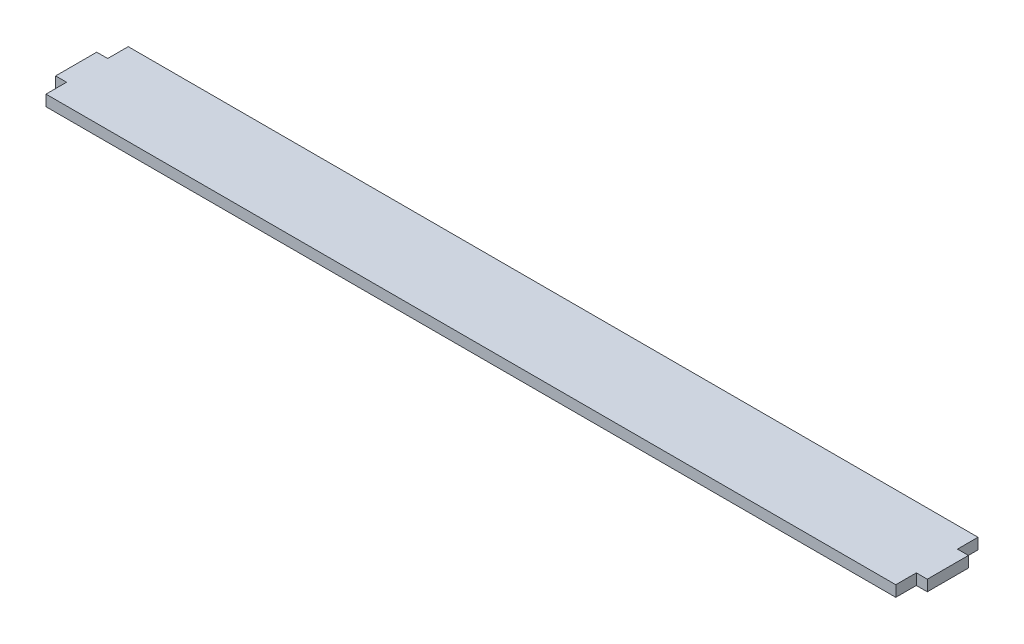
ISO-10303-21;
HEADER;
FILE_DESCRIPTION(('STEP AP214'),'2;1');
FILE_NAME('part.step','',(''),(''),'','','');
FILE_SCHEMA(('AUTOMOTIVE_DESIGN { 1 0 10303 214 1 1 1 1 }'));
ENDSEC;
DATA;
#1=APPLICATION_CONTEXT('core data for automotive mechanical design processes');
#2=APPLICATION_PROTOCOL_DEFINITION('international standard','automotive_design',2000,#1);
#3=PRODUCT_CONTEXT('',#1,'mechanical');
#4=PRODUCT('Part','Part','',(#3));
#5=PRODUCT_RELATED_PRODUCT_CATEGORY('part','',(#4));
#6=PRODUCT_DEFINITION_FORMATION('','',#4);
#7=PRODUCT_DEFINITION_CONTEXT('part definition',#1,'design');
#8=PRODUCT_DEFINITION('design','',#6,#7);
#9=PRODUCT_DEFINITION_SHAPE('','',#8);
#10=(LENGTH_UNIT() NAMED_UNIT(*) SI_UNIT(.MILLI.,.METRE.));
#11=(NAMED_UNIT(*) PLANE_ANGLE_UNIT() SI_UNIT($,.RADIAN.));
#12=(NAMED_UNIT(*) SI_UNIT($,.STERADIAN.) SOLID_ANGLE_UNIT());
#13=UNCERTAINTY_MEASURE_WITH_UNIT(LENGTH_MEASURE(1.E-05),#10,'distance_accuracy_value','');
#14=(GEOMETRIC_REPRESENTATION_CONTEXT(3) GLOBAL_UNCERTAINTY_ASSIGNED_CONTEXT((#13)) GLOBAL_UNIT_ASSIGNED_CONTEXT((#10,
#11,#12)) REPRESENTATION_CONTEXT('',''));
#15=CARTESIAN_POINT('',(0.,0.,0.));
#16=DIRECTION('',(0.,0.,1.));
#17=DIRECTION('',(1.,0.,0.));
#18=AXIS2_PLACEMENT_3D('',#15,#16,#17);
#19=CARTESIAN_POINT('',(159.,4.,0.));
#20=DIRECTION('',(1.,0.,0.));
#21=DIRECTION('',(0.,0.,-1.));
#22=AXIS2_PLACEMENT_3D('',#19,#20,#21);
#23=PLANE('',#22);
#24=DIRECTION('',(0.,0.,1.));
#25=VECTOR('',#24,1.);
#26=CARTESIAN_POINT('',(159.,0.,0.));
#27=LINE('',#26,#25);
#28=CARTESIAN_POINT('',(159.,0.,-7.5));
#29=VERTEX_POINT('',#28);
#30=CARTESIAN_POINT('',(159.,0.,7.5));
#31=VERTEX_POINT('',#30);
#32=EDGE_CURVE('E204',#29,#31,#27,.T.);
#33=ORIENTED_EDGE('',*,*,#32,.F.);
#34=DIRECTION('',(0.,-1.,0.));
#35=VECTOR('',#34,1.);
#36=CARTESIAN_POINT('',(159.,4.,-7.5));
#37=LINE('',#36,#35);
#38=CARTESIAN_POINT('',(159.,4.,-7.5));
#39=VERTEX_POINT('',#38);
#40=EDGE_CURVE('E12',#39,#29,#37,.T.);
#41=ORIENTED_EDGE('',*,*,#40,.F.);
#42=DIRECTION('',(0.,0.,1.));
#43=VECTOR('',#42,1.);
#44=CARTESIAN_POINT('',(159.,4.,0.));
#45=LINE('',#44,#43);
#46=CARTESIAN_POINT('',(159.,4.,7.5));
#47=VERTEX_POINT('',#46);
#48=EDGE_CURVE('E266',#39,#47,#45,.T.);
#49=ORIENTED_EDGE('',*,*,#48,.T.);
#50=DIRECTION('',(0.,-1.,0.));
#51=VECTOR('',#50,1.);
#52=CARTESIAN_POINT('',(159.,4.,7.5));
#53=LINE('',#52,#51);
#54=EDGE_CURVE('E261',#47,#31,#53,.T.);
#55=ORIENTED_EDGE('',*,*,#54,.T.);
#56=EDGE_LOOP('',(#33,#41,#49,#55));
#57=FACE_BOUND('',#56,.T.);
#58=ADVANCED_FACE('F87',(#57),#23,.T.);
#59=CARTESIAN_POINT('',(0.,4.,-7.5));
#60=DIRECTION('',(0.,0.,-1.));
#61=DIRECTION('',(-1.,0.,0.));
#62=AXIS2_PLACEMENT_3D('',#59,#60,#61);
#63=PLANE('',#62);
#64=DIRECTION('',(1.,0.,0.));
#65=VECTOR('',#64,1.);
#66=CARTESIAN_POINT('',(0.,0.,-7.5));
#67=LINE('',#66,#65);
#68=CARTESIAN_POINT('',(155.,0.,-7.5));
#69=VERTEX_POINT('',#68);
#70=EDGE_CURVE('E267',#69,#29,#67,.T.);
#71=ORIENTED_EDGE('',*,*,#70,.F.);
#72=DIRECTION('',(0.,-1.,0.));
#73=VECTOR('',#72,1.);
#74=CARTESIAN_POINT('',(155.,4.,-7.5));
#75=LINE('',#74,#73);
#76=CARTESIAN_POINT('',(155.,4.,-7.5));
#77=VERTEX_POINT('',#76);
#78=EDGE_CURVE('E97',#77,#69,#75,.T.);
#79=ORIENTED_EDGE('',*,*,#78,.F.);
#80=DIRECTION('',(1.,0.,0.));
#81=VECTOR('',#80,1.);
#82=CARTESIAN_POINT('',(0.,4.,-7.5));
#83=LINE('',#82,#81);
#84=EDGE_CURVE('E272',#77,#39,#83,.T.);
#85=ORIENTED_EDGE('',*,*,#84,.T.);
#86=ORIENTED_EDGE('',*,*,#40,.T.);
#87=EDGE_LOOP('',(#71,#79,#85,#86));
#88=FACE_BOUND('',#87,.T.);
#89=ADVANCED_FACE('F286',(#88),#63,.T.);
#90=CARTESIAN_POINT('',(0.,4.,7.5));
#91=DIRECTION('',(0.,0.,-1.));
#92=DIRECTION('',(-1.,0.,0.));
#93=AXIS2_PLACEMENT_3D('',#90,#91,#92);
#94=PLANE('',#93);
#95=DIRECTION('',(1.,0.,0.));
#96=VECTOR('',#95,1.);
#97=CARTESIAN_POINT('',(0.,0.,7.5));
#98=LINE('',#97,#96);
#99=CARTESIAN_POINT('',(155.,0.,7.5));
#100=VERTEX_POINT('',#99);
#101=EDGE_CURVE('E263',#100,#31,#98,.T.);
#102=ORIENTED_EDGE('',*,*,#101,.T.);
#103=ORIENTED_EDGE('',*,*,#54,.F.);
#104=DIRECTION('',(1.,0.,0.));
#105=VECTOR('',#104,1.);
#106=CARTESIAN_POINT('',(0.,4.,7.5));
#107=LINE('',#106,#105);
#108=CARTESIAN_POINT('',(155.,4.,7.5));
#109=VERTEX_POINT('',#108);
#110=EDGE_CURVE('E106',#109,#47,#107,.T.);
#111=ORIENTED_EDGE('',*,*,#110,.F.);
#112=DIRECTION('',(0.,-1.,0.));
#113=VECTOR('',#112,1.);
#114=CARTESIAN_POINT('',(155.,4.,7.5));
#115=LINE('',#114,#113);
#116=EDGE_CURVE('E259',#109,#100,#115,.T.);
#117=ORIENTED_EDGE('',*,*,#116,.T.);
#118=EDGE_LOOP('',(#102,#103,#111,#117));
#119=FACE_BOUND('',#118,.T.);
#120=ADVANCED_FACE('F298',(#119),#94,.F.);
#121=CARTESIAN_POINT('',(0.,4.,0.));
#122=DIRECTION('',(0.,1.,0.));
#123=DIRECTION('',(0.,0.,1.));
#124=AXIS2_PLACEMENT_3D('',#121,#122,#123);
#125=PLANE('',#124);
#126=ORIENTED_EDGE('',*,*,#48,.F.);
#127=ORIENTED_EDGE('',*,*,#84,.F.);
#128=DIRECTION('',(0.,0.,1.));
#129=VECTOR('',#128,1.);
#130=CARTESIAN_POINT('',(155.,4.,-15.));
#131=LINE('',#130,#129);
#132=CARTESIAN_POINT('',(155.,4.,-15.));
#133=VERTEX_POINT('',#132);
#134=EDGE_CURVE('E255',#133,#77,#131,.T.);
#135=ORIENTED_EDGE('',*,*,#134,.F.);
#136=DIRECTION('',(1.,0.,0.));
#137=VECTOR('',#136,1.);
#138=CARTESIAN_POINT('',(-155.,4.,-15.));
#139=LINE('',#138,#137);
#140=CARTESIAN_POINT('',(-155.,4.,-15.));
#141=VERTEX_POINT('',#140);
#142=EDGE_CURVE('E233',#141,#133,#139,.T.);
#143=ORIENTED_EDGE('',*,*,#142,.F.);
#144=DIRECTION('',(0.,0.,1.));
#145=VECTOR('',#144,1.);
#146=CARTESIAN_POINT('',(-155.,4.,-15.));
#147=LINE('',#146,#145);
#148=CARTESIAN_POINT('',(-155.,4.,-7.5));
#149=VERTEX_POINT('',#148);
#150=EDGE_CURVE('E225',#141,#149,#147,.T.);
#151=ORIENTED_EDGE('',*,*,#150,.T.);
#152=DIRECTION('',(-1.,0.,0.));
#153=VECTOR('',#152,1.);
#154=CARTESIAN_POINT('',(-155.,4.,-7.5));
#155=LINE('',#154,#153);
#156=CARTESIAN_POINT('',(-159.,4.,-7.5));
#157=VERTEX_POINT('',#156);
#158=EDGE_CURVE('E195',#149,#157,#155,.T.);
#159=ORIENTED_EDGE('',*,*,#158,.T.);
#160=DIRECTION('',(0.,0.,1.));
#161=VECTOR('',#160,1.);
#162=CARTESIAN_POINT('',(-159.,4.,-7.5));
#163=LINE('',#162,#161);
#164=CARTESIAN_POINT('',(-159.,4.,7.5));
#165=VERTEX_POINT('',#164);
#166=EDGE_CURVE('E198',#157,#165,#163,.T.);
#167=ORIENTED_EDGE('',*,*,#166,.T.);
#168=DIRECTION('',(-1.,0.,0.));
#169=VECTOR('',#168,1.);
#170=CARTESIAN_POINT('',(-155.,4.,7.5));
#171=LINE('',#170,#169);
#172=CARTESIAN_POINT('',(-155.,4.,7.5));
#173=VERTEX_POINT('',#172);
#174=EDGE_CURVE('E184',#173,#165,#171,.T.);
#175=ORIENTED_EDGE('',*,*,#174,.F.);
#176=CARTESIAN_POINT('',(-155.,4.,15.));
#177=VERTEX_POINT('',#176);
#178=EDGE_CURVE('E251',#173,#177,#147,.T.);
#179=ORIENTED_EDGE('',*,*,#178,.T.);
#180=DIRECTION('',(1.,0.,0.));
#181=VECTOR('',#180,1.);
#182=CARTESIAN_POINT('',(-155.,4.,15.));
#183=LINE('',#182,#181);
#184=CARTESIAN_POINT('',(155.,4.,15.));
#185=VERTEX_POINT('',#184);
#186=EDGE_CURVE('E252',#177,#185,#183,.T.);
#187=ORIENTED_EDGE('',*,*,#186,.T.);
#188=EDGE_CURVE('E235',#109,#185,#131,.T.);
#189=ORIENTED_EDGE('',*,*,#188,.F.);
#190=ORIENTED_EDGE('',*,*,#110,.T.);
#191=EDGE_LOOP('',(#126,#127,#135,#143,#151,#159,#167,#175,#179,#187,#189,#190));
#192=FACE_BOUND('',#191,.T.);
#193=ADVANCED_FACE('F280',(#192),#125,.T.);
#194=CARTESIAN_POINT('',(0.,0.,0.));
#195=DIRECTION('',(0.,1.,0.));
#196=DIRECTION('',(0.,0.,1.));
#197=AXIS2_PLACEMENT_3D('',#194,#195,#196);
#198=PLANE('',#197);
#199=ORIENTED_EDGE('',*,*,#32,.T.);
#200=ORIENTED_EDGE('',*,*,#101,.F.);
#201=DIRECTION('',(0.,0.,1.));
#202=VECTOR('',#201,1.);
#203=CARTESIAN_POINT('',(155.,0.,-15.));
#204=LINE('',#203,#202);
#205=CARTESIAN_POINT('',(155.,0.,15.));
#206=VERTEX_POINT('',#205);
#207=EDGE_CURVE('E244',#100,#206,#204,.T.);
#208=ORIENTED_EDGE('',*,*,#207,.T.);
#209=DIRECTION('',(1.,0.,0.));
#210=VECTOR('',#209,1.);
#211=CARTESIAN_POINT('',(-155.,0.,15.));
#212=LINE('',#211,#210);
#213=CARTESIAN_POINT('',(-155.,0.,15.));
#214=VERTEX_POINT('',#213);
#215=EDGE_CURVE('E237',#214,#206,#212,.T.);
#216=ORIENTED_EDGE('',*,*,#215,.F.);
#217=DIRECTION('',(0.,0.,1.));
#218=VECTOR('',#217,1.);
#219=CARTESIAN_POINT('',(-155.,0.,-15.));
#220=LINE('',#219,#218);
#221=CARTESIAN_POINT('',(-155.,0.,7.5));
#222=VERTEX_POINT('',#221);
#223=EDGE_CURVE('E194',#222,#214,#220,.T.);
#224=ORIENTED_EDGE('',*,*,#223,.F.);
#225=DIRECTION('',(-1.,0.,0.));
#226=VECTOR('',#225,1.);
#227=CARTESIAN_POINT('',(-155.,0.,7.5));
#228=LINE('',#227,#226);
#229=CARTESIAN_POINT('',(-159.,0.,7.5));
#230=VERTEX_POINT('',#229);
#231=EDGE_CURVE('E181',#222,#230,#228,.T.);
#232=ORIENTED_EDGE('',*,*,#231,.T.);
#233=DIRECTION('',(0.,0.,1.));
#234=VECTOR('',#233,1.);
#235=CARTESIAN_POINT('',(-159.,0.,-7.5));
#236=LINE('',#235,#234);
#237=CARTESIAN_POINT('',(-159.,0.,-7.5));
#238=VERTEX_POINT('',#237);
#239=EDGE_CURVE('E172',#238,#230,#236,.T.);
#240=ORIENTED_EDGE('',*,*,#239,.F.);
#241=DIRECTION('',(-1.,0.,0.));
#242=VECTOR('',#241,1.);
#243=CARTESIAN_POINT('',(-155.,0.,-7.5));
#244=LINE('',#243,#242);
#245=CARTESIAN_POINT('',(-155.,0.,-7.5));
#246=VERTEX_POINT('',#245);
#247=EDGE_CURVE('E189',#246,#238,#244,.T.);
#248=ORIENTED_EDGE('',*,*,#247,.F.);
#249=CARTESIAN_POINT('',(-155.,0.,-15.));
#250=VERTEX_POINT('',#249);
#251=EDGE_CURVE('E219',#250,#246,#220,.T.);
#252=ORIENTED_EDGE('',*,*,#251,.F.);
#253=DIRECTION('',(1.,0.,0.));
#254=VECTOR('',#253,1.);
#255=CARTESIAN_POINT('',(-155.,0.,-15.));
#256=LINE('',#255,#254);
#257=CARTESIAN_POINT('',(155.,0.,-15.));
#258=VERTEX_POINT('',#257);
#259=EDGE_CURVE('E247',#250,#258,#256,.T.);
#260=ORIENTED_EDGE('',*,*,#259,.T.);
#261=EDGE_CURVE('E240',#258,#69,#204,.T.);
#262=ORIENTED_EDGE('',*,*,#261,.T.);
#263=ORIENTED_EDGE('',*,*,#70,.T.);
#264=EDGE_LOOP('',(#199,#200,#208,#216,#224,#232,#240,#248,#252,#260,#262,#263));
#265=FACE_BOUND('',#264,.T.);
#266=ADVANCED_FACE('F192',(#265),#198,.F.);
#267=CARTESIAN_POINT('',(-155.,4.,7.5));
#268=DIRECTION('',(0.,0.,1.));
#269=DIRECTION('',(1.,0.,0.));
#270=AXIS2_PLACEMENT_3D('',#267,#268,#269);
#271=PLANE('',#270);
#272=ORIENTED_EDGE('',*,*,#231,.F.);
#273=DIRECTION('',(0.,-1.,0.));
#274=VECTOR('',#273,1.);
#275=CARTESIAN_POINT('',(-155.,4.,7.5));
#276=LINE('',#275,#274);
#277=EDGE_CURVE('E205',#173,#222,#276,.T.);
#278=ORIENTED_EDGE('',*,*,#277,.F.);
#279=ORIENTED_EDGE('',*,*,#174,.T.);
#280=DIRECTION('',(0.,-1.,0.));
#281=VECTOR('',#280,1.);
#282=CARTESIAN_POINT('',(-159.,4.,7.5));
#283=LINE('',#282,#281);
#284=EDGE_CURVE('E179',#165,#230,#283,.T.);
#285=ORIENTED_EDGE('',*,*,#284,.T.);
#286=EDGE_LOOP('',(#272,#278,#279,#285));
#287=FACE_BOUND('',#286,.T.);
#288=ADVANCED_FACE('F180',(#287),#271,.T.);
#289=CARTESIAN_POINT('',(-159.,4.,-7.5));
#290=DIRECTION('',(1.,0.,0.));
#291=DIRECTION('',(0.,0.,-1.));
#292=AXIS2_PLACEMENT_3D('',#289,#290,#291);
#293=PLANE('',#292);
#294=ORIENTED_EDGE('',*,*,#239,.T.);
#295=ORIENTED_EDGE('',*,*,#284,.F.);
#296=ORIENTED_EDGE('',*,*,#166,.F.);
#297=DIRECTION('',(0.,-1.,0.));
#298=VECTOR('',#297,1.);
#299=CARTESIAN_POINT('',(-159.,4.,-7.5));
#300=LINE('',#299,#298);
#301=EDGE_CURVE('E91',#157,#238,#300,.T.);
#302=ORIENTED_EDGE('',*,*,#301,.T.);
#303=EDGE_LOOP('',(#294,#295,#296,#302));
#304=FACE_BOUND('',#303,.T.);
#305=ADVANCED_FACE('F186',(#304),#293,.F.);
#306=CARTESIAN_POINT('',(-155.,4.,-7.5));
#307=DIRECTION('',(0.,0.,1.));
#308=DIRECTION('',(1.,0.,0.));
#309=AXIS2_PLACEMENT_3D('',#306,#307,#308);
#310=PLANE('',#309);
#311=ORIENTED_EDGE('',*,*,#247,.T.);
#312=ORIENTED_EDGE('',*,*,#301,.F.);
#313=ORIENTED_EDGE('',*,*,#158,.F.);
#314=DIRECTION('',(0.,-1.,0.));
#315=VECTOR('',#314,1.);
#316=CARTESIAN_POINT('',(-155.,4.,-7.5));
#317=LINE('',#316,#315);
#318=EDGE_CURVE('E202',#149,#246,#317,.T.);
#319=ORIENTED_EDGE('',*,*,#318,.T.);
#320=EDGE_LOOP('',(#311,#312,#313,#319));
#321=FACE_BOUND('',#320,.T.);
#322=ADVANCED_FACE('F89',(#321),#310,.F.);
#323=CARTESIAN_POINT('',(-155.,4.,-15.));
#324=DIRECTION('',(1.,0.,0.));
#325=DIRECTION('',(0.,0.,-1.));
#326=AXIS2_PLACEMENT_3D('',#323,#324,#325);
#327=PLANE('',#326);
#328=ORIENTED_EDGE('',*,*,#178,.F.);
#329=ORIENTED_EDGE('',*,*,#277,.T.);
#330=ORIENTED_EDGE('',*,*,#223,.T.);
#331=DIRECTION('',(0.,-1.,0.));
#332=VECTOR('',#331,1.);
#333=CARTESIAN_POINT('',(-155.,4.,15.));
#334=LINE('',#333,#332);
#335=EDGE_CURVE('E209',#177,#214,#334,.T.);
#336=ORIENTED_EDGE('',*,*,#335,.F.);
#337=EDGE_LOOP('',(#328,#329,#330,#336));
#338=FACE_BOUND('',#337,.T.);
#339=ADVANCED_FACE('F293',(#338),#327,.F.);
#340=ORIENTED_EDGE('',*,*,#318,.F.);
#341=ORIENTED_EDGE('',*,*,#150,.F.);
#342=DIRECTION('',(0.,-1.,0.));
#343=VECTOR('',#342,1.);
#344=CARTESIAN_POINT('',(-155.,4.,-15.));
#345=LINE('',#344,#343);
#346=EDGE_CURVE('E206',#141,#250,#345,.T.);
#347=ORIENTED_EDGE('',*,*,#346,.T.);
#348=ORIENTED_EDGE('',*,*,#251,.T.);
#349=EDGE_LOOP('',(#340,#341,#347,#348));
#350=FACE_BOUND('',#349,.T.);
#351=ADVANCED_FACE('F232',(#350),#327,.F.);
#352=CARTESIAN_POINT('',(-155.,4.,15.));
#353=DIRECTION('',(0.,0.,-1.));
#354=DIRECTION('',(-1.,0.,0.));
#355=AXIS2_PLACEMENT_3D('',#352,#353,#354);
#356=PLANE('',#355);
#357=ORIENTED_EDGE('',*,*,#215,.T.);
#358=DIRECTION('',(0.,-1.,0.));
#359=VECTOR('',#358,1.);
#360=CARTESIAN_POINT('',(155.,4.,15.));
#361=LINE('',#360,#359);
#362=EDGE_CURVE('E216',#185,#206,#361,.T.);
#363=ORIENTED_EDGE('',*,*,#362,.F.);
#364=ORIENTED_EDGE('',*,*,#186,.F.);
#365=ORIENTED_EDGE('',*,*,#335,.T.);
#366=EDGE_LOOP('',(#357,#363,#364,#365));
#367=FACE_BOUND('',#366,.T.);
#368=ADVANCED_FACE('F295',(#367),#356,.F.);
#369=CARTESIAN_POINT('',(-155.,4.,-15.));
#370=DIRECTION('',(0.,0.,-1.));
#371=DIRECTION('',(-1.,0.,0.));
#372=AXIS2_PLACEMENT_3D('',#369,#370,#371);
#373=PLANE('',#372);
#374=ORIENTED_EDGE('',*,*,#259,.F.);
#375=ORIENTED_EDGE('',*,*,#346,.F.);
#376=ORIENTED_EDGE('',*,*,#142,.T.);
#377=DIRECTION('',(0.,-1.,0.));
#378=VECTOR('',#377,1.);
#379=CARTESIAN_POINT('',(155.,4.,-15.));
#380=LINE('',#379,#378);
#381=EDGE_CURVE('E224',#133,#258,#380,.T.);
#382=ORIENTED_EDGE('',*,*,#381,.T.);
#383=EDGE_LOOP('',(#374,#375,#376,#382));
#384=FACE_BOUND('',#383,.T.);
#385=ADVANCED_FACE('F292',(#384),#373,.T.);
#386=CARTESIAN_POINT('',(155.,4.,-15.));
#387=DIRECTION('',(1.,0.,0.));
#388=DIRECTION('',(0.,0.,-1.));
#389=AXIS2_PLACEMENT_3D('',#386,#387,#388);
#390=PLANE('',#389);
#391=ORIENTED_EDGE('',*,*,#134,.T.);
#392=ORIENTED_EDGE('',*,*,#78,.T.);
#393=ORIENTED_EDGE('',*,*,#261,.F.);
#394=ORIENTED_EDGE('',*,*,#381,.F.);
#395=EDGE_LOOP('',(#391,#392,#393,#394));
#396=FACE_BOUND('',#395,.T.);
#397=ADVANCED_FACE('F289',(#396),#390,.T.);
#398=ORIENTED_EDGE('',*,*,#116,.F.);
#399=ORIENTED_EDGE('',*,*,#188,.T.);
#400=ORIENTED_EDGE('',*,*,#362,.T.);
#401=ORIENTED_EDGE('',*,*,#207,.F.);
#402=EDGE_LOOP('',(#398,#399,#400,#401));
#403=FACE_BOUND('',#402,.T.);
#404=ADVANCED_FACE('F301',(#403),#390,.T.);
#405=CLOSED_SHELL('',(#58,#89,#120,#193,#266,#288,#305,#322,#339,#351,#368,#385,#397,#404));
#406=MANIFOLD_SOLID_BREP('B2',#405);
#407=ADVANCED_BREP_SHAPE_REPRESENTATION('',(#18,#406),#14);
#408=SHAPE_DEFINITION_REPRESENTATION(#9,#407);
ENDSEC;
END-ISO-10303-21;
